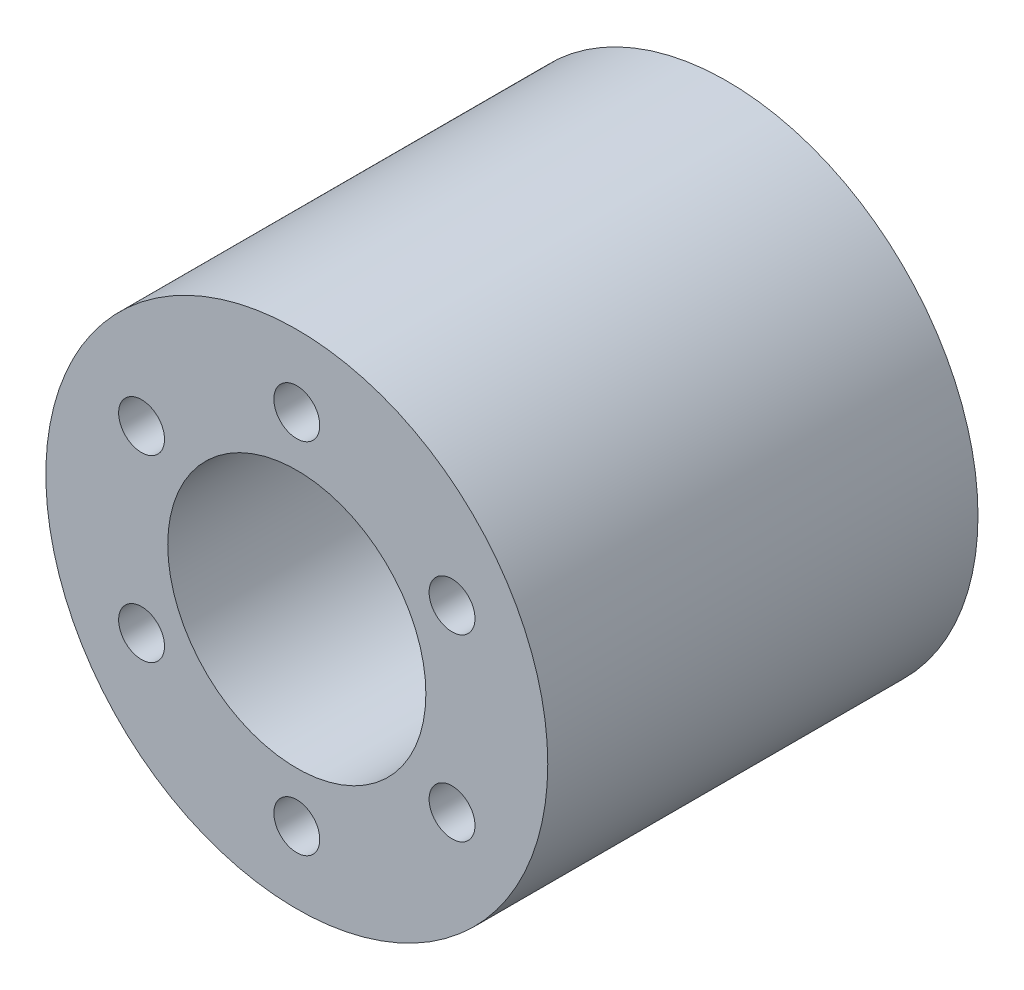
ISO-10303-21;
HEADER;
FILE_DESCRIPTION(('STEP AP214'),'2;1');
FILE_NAME('part.step','',(''),(''),'','','');
FILE_SCHEMA(('AUTOMOTIVE_DESIGN { 1 0 10303 214 1 1 1 1 }'));
ENDSEC;
DATA;
#1=APPLICATION_CONTEXT('core data for automotive mechanical design processes');
#2=APPLICATION_PROTOCOL_DEFINITION('international standard','automotive_design',2000,#1);
#3=PRODUCT_CONTEXT('',#1,'mechanical');
#4=PRODUCT('Part','Part','',(#3));
#5=PRODUCT_RELATED_PRODUCT_CATEGORY('part','',(#4));
#6=PRODUCT_DEFINITION_FORMATION('','',#4);
#7=PRODUCT_DEFINITION_CONTEXT('part definition',#1,'design');
#8=PRODUCT_DEFINITION('design','',#6,#7);
#9=PRODUCT_DEFINITION_SHAPE('','',#8);
#10=(LENGTH_UNIT() NAMED_UNIT(*) SI_UNIT(.MILLI.,.METRE.));
#11=(NAMED_UNIT(*) PLANE_ANGLE_UNIT() SI_UNIT($,.RADIAN.));
#12=(NAMED_UNIT(*) SI_UNIT($,.STERADIAN.) SOLID_ANGLE_UNIT());
#13=UNCERTAINTY_MEASURE_WITH_UNIT(LENGTH_MEASURE(1.E-05),#10,'distance_accuracy_value','');
#14=(GEOMETRIC_REPRESENTATION_CONTEXT(3) GLOBAL_UNCERTAINTY_ASSIGNED_CONTEXT((#13)) GLOBAL_UNIT_ASSIGNED_CONTEXT((#10,
#11,#12)) REPRESENTATION_CONTEXT('',''));
#15=CARTESIAN_POINT('',(0.,0.,0.));
#16=DIRECTION('',(0.,0.,1.));
#17=DIRECTION('',(1.,0.,0.));
#18=AXIS2_PLACEMENT_3D('',#15,#16,#17);
#19=CARTESIAN_POINT('',(0.,0.,30.));
#20=DIRECTION('',(0.,0.,1.));
#21=DIRECTION('',(1.,0.,0.));
#22=AXIS2_PLACEMENT_3D('',#19,#20,#21);
#23=PLANE('',#22);
#24=CARTESIAN_POINT('',(-10.8253175473055,6.24999999999999,30.));
#25=DIRECTION('',(0.,0.,1.));
#26=DIRECTION('',(1.,0.,0.));
#27=AXIS2_PLACEMENT_3D('',#24,#25,#26);
#28=CIRCLE('',#27,1.6);
#29=CARTESIAN_POINT('',(-9.22531754730549,6.24999999999999,30.));
#30=VERTEX_POINT('',#29);
#31=EDGE_CURVE('E71',#30,#30,#28,.T.);
#32=ORIENTED_EDGE('',*,*,#31,.F.);
#33=EDGE_LOOP('',(#32));
#34=FACE_BOUND('',#33,.T.);
#35=CARTESIAN_POINT('',(0.,-12.5,30.));
#36=DIRECTION('',(0.,0.,1.));
#37=DIRECTION('',(1.,0.,0.));
#38=AXIS2_PLACEMENT_3D('',#35,#36,#37);
#39=CIRCLE('',#38,1.6);
#40=CARTESIAN_POINT('',(1.6,-12.5,30.));
#41=VERTEX_POINT('',#40);
#42=EDGE_CURVE('E59',#41,#41,#39,.T.);
#43=ORIENTED_EDGE('',*,*,#42,.F.);
#44=EDGE_LOOP('',(#43));
#45=FACE_BOUND('',#44,.T.);
#46=CARTESIAN_POINT('',(10.8253175473055,6.25000000000001,30.));
#47=DIRECTION('',(0.,0.,1.));
#48=DIRECTION('',(1.,0.,0.));
#49=AXIS2_PLACEMENT_3D('',#46,#47,#48);
#50=CIRCLE('',#49,1.6);
#51=CARTESIAN_POINT('',(12.4253175473055,6.25000000000001,30.));
#52=VERTEX_POINT('',#51);
#53=EDGE_CURVE('E47',#52,#52,#50,.T.);
#54=ORIENTED_EDGE('',*,*,#53,.F.);
#55=EDGE_LOOP('',(#54));
#56=FACE_BOUND('',#55,.T.);
#57=CARTESIAN_POINT('',(0.,0.,30.));
#58=DIRECTION('',(0.,0.,1.));
#59=DIRECTION('',(1.,0.,0.));
#60=AXIS2_PLACEMENT_3D('',#57,#58,#59);
#61=CIRCLE('',#60,17.5);
#62=CARTESIAN_POINT('',(17.5,0.,30.));
#63=VERTEX_POINT('',#62);
#64=EDGE_CURVE('E10',#63,#63,#61,.T.);
#65=ORIENTED_EDGE('',*,*,#64,.T.);
#66=EDGE_LOOP('',(#65));
#67=FACE_BOUND('',#66,.T.);
#68=CARTESIAN_POINT('',(0.,12.5,30.));
#69=DIRECTION('',(0.,0.,1.));
#70=DIRECTION('',(1.,0.,0.));
#71=AXIS2_PLACEMENT_3D('',#68,#69,#70);
#72=CIRCLE('',#71,1.6);
#73=CARTESIAN_POINT('',(1.6,12.5,30.));
#74=VERTEX_POINT('',#73);
#75=EDGE_CURVE('E42',#74,#74,#72,.T.);
#76=ORIENTED_EDGE('',*,*,#75,.F.);
#77=EDGE_LOOP('',(#76));
#78=FACE_BOUND('',#77,.T.);
#79=CARTESIAN_POINT('',(10.8253175473055,-6.25,30.));
#80=DIRECTION('',(0.,0.,1.));
#81=DIRECTION('',(1.,0.,0.));
#82=AXIS2_PLACEMENT_3D('',#79,#80,#81);
#83=CIRCLE('',#82,1.6);
#84=CARTESIAN_POINT('',(12.4253175473055,-6.25,30.));
#85=VERTEX_POINT('',#84);
#86=EDGE_CURVE('E53',#85,#85,#83,.T.);
#87=ORIENTED_EDGE('',*,*,#86,.F.);
#88=EDGE_LOOP('',(#87));
#89=FACE_BOUND('',#88,.T.);
#90=CARTESIAN_POINT('',(-10.8253175473055,-6.25000000000001,30.));
#91=DIRECTION('',(0.,0.,1.));
#92=DIRECTION('',(1.,0.,0.));
#93=AXIS2_PLACEMENT_3D('',#90,#91,#92);
#94=CIRCLE('',#93,1.6);
#95=CARTESIAN_POINT('',(-9.22531754730549,-6.25000000000001,30.));
#96=VERTEX_POINT('',#95);
#97=EDGE_CURVE('E65',#96,#96,#94,.T.);
#98=ORIENTED_EDGE('',*,*,#97,.F.);
#99=EDGE_LOOP('',(#98));
#100=FACE_BOUND('',#99,.T.);
#101=CARTESIAN_POINT('',(0.,0.,30.));
#102=DIRECTION('',(0.,0.,1.));
#103=DIRECTION('',(1.,0.,0.));
#104=AXIS2_PLACEMENT_3D('',#101,#102,#103);
#105=CIRCLE('',#104,9.);
#106=CARTESIAN_POINT('',(9.,0.,30.));
#107=VERTEX_POINT('',#106);
#108=EDGE_CURVE('E77',#107,#107,#105,.T.);
#109=ORIENTED_EDGE('',*,*,#108,.F.);
#110=EDGE_LOOP('',(#109));
#111=FACE_BOUND('',#110,.T.);
#112=ADVANCED_FACE('F31',(#34,#45,#56,#67,#78,#89,#100,#111),#23,.T.);
#113=CARTESIAN_POINT('',(0.,0.,0.));
#114=DIRECTION('',(0.,0.,1.));
#115=DIRECTION('',(1.,0.,0.));
#116=AXIS2_PLACEMENT_3D('',#113,#114,#115);
#117=PLANE('',#116);
#118=CARTESIAN_POINT('',(0.,0.,0.));
#119=DIRECTION('',(0.,0.,1.));
#120=DIRECTION('',(1.,0.,0.));
#121=AXIS2_PLACEMENT_3D('',#118,#119,#120);
#122=CIRCLE('',#121,17.5);
#123=CARTESIAN_POINT('',(17.5,0.,0.));
#124=VERTEX_POINT('',#123);
#125=EDGE_CURVE('E35',#124,#124,#122,.T.);
#126=ORIENTED_EDGE('',*,*,#125,.F.);
#127=EDGE_LOOP('',(#126));
#128=FACE_BOUND('',#127,.T.);
#129=CARTESIAN_POINT('',(0.,12.5,0.));
#130=DIRECTION('',(0.,0.,1.));
#131=DIRECTION('',(1.,0.,0.));
#132=AXIS2_PLACEMENT_3D('',#129,#130,#131);
#133=CIRCLE('',#132,1.6);
#134=CARTESIAN_POINT('',(1.6,12.5,0.));
#135=VERTEX_POINT('',#134);
#136=EDGE_CURVE('E44',#135,#135,#133,.T.);
#137=ORIENTED_EDGE('',*,*,#136,.T.);
#138=EDGE_LOOP('',(#137));
#139=FACE_BOUND('',#138,.T.);
#140=CARTESIAN_POINT('',(10.8253175473055,6.25000000000001,0.));
#141=DIRECTION('',(0.,0.,1.));
#142=DIRECTION('',(1.,0.,0.));
#143=AXIS2_PLACEMENT_3D('',#140,#141,#142);
#144=CIRCLE('',#143,1.6);
#145=CARTESIAN_POINT('',(12.4253175473055,6.25000000000001,0.));
#146=VERTEX_POINT('',#145);
#147=EDGE_CURVE('E50',#146,#146,#144,.T.);
#148=ORIENTED_EDGE('',*,*,#147,.T.);
#149=EDGE_LOOP('',(#148));
#150=FACE_BOUND('',#149,.T.);
#151=CARTESIAN_POINT('',(10.8253175473055,-6.25,0.));
#152=DIRECTION('',(0.,0.,1.));
#153=DIRECTION('',(1.,0.,0.));
#154=AXIS2_PLACEMENT_3D('',#151,#152,#153);
#155=CIRCLE('',#154,1.6);
#156=CARTESIAN_POINT('',(12.4253175473055,-6.25,0.));
#157=VERTEX_POINT('',#156);
#158=EDGE_CURVE('E56',#157,#157,#155,.T.);
#159=ORIENTED_EDGE('',*,*,#158,.T.);
#160=EDGE_LOOP('',(#159));
#161=FACE_BOUND('',#160,.T.);
#162=CARTESIAN_POINT('',(0.,-12.5,0.));
#163=DIRECTION('',(0.,0.,1.));
#164=DIRECTION('',(1.,0.,0.));
#165=AXIS2_PLACEMENT_3D('',#162,#163,#164);
#166=CIRCLE('',#165,1.6);
#167=CARTESIAN_POINT('',(1.6,-12.5,0.));
#168=VERTEX_POINT('',#167);
#169=EDGE_CURVE('E62',#168,#168,#166,.T.);
#170=ORIENTED_EDGE('',*,*,#169,.T.);
#171=EDGE_LOOP('',(#170));
#172=FACE_BOUND('',#171,.T.);
#173=CARTESIAN_POINT('',(-10.8253175473055,-6.25000000000001,0.));
#174=DIRECTION('',(0.,0.,1.));
#175=DIRECTION('',(1.,0.,0.));
#176=AXIS2_PLACEMENT_3D('',#173,#174,#175);
#177=CIRCLE('',#176,1.6);
#178=CARTESIAN_POINT('',(-9.22531754730549,-6.25000000000001,0.));
#179=VERTEX_POINT('',#178);
#180=EDGE_CURVE('E68',#179,#179,#177,.T.);
#181=ORIENTED_EDGE('',*,*,#180,.T.);
#182=EDGE_LOOP('',(#181));
#183=FACE_BOUND('',#182,.T.);
#184=CARTESIAN_POINT('',(-10.8253175473055,6.24999999999999,0.));
#185=DIRECTION('',(0.,0.,1.));
#186=DIRECTION('',(1.,0.,0.));
#187=AXIS2_PLACEMENT_3D('',#184,#185,#186);
#188=CIRCLE('',#187,1.6);
#189=CARTESIAN_POINT('',(-9.22531754730549,6.24999999999999,0.));
#190=VERTEX_POINT('',#189);
#191=EDGE_CURVE('E74',#190,#190,#188,.T.);
#192=ORIENTED_EDGE('',*,*,#191,.T.);
#193=EDGE_LOOP('',(#192));
#194=FACE_BOUND('',#193,.T.);
#195=CARTESIAN_POINT('',(0.,0.,0.));
#196=DIRECTION('',(0.,0.,1.));
#197=DIRECTION('',(1.,0.,0.));
#198=AXIS2_PLACEMENT_3D('',#195,#196,#197);
#199=CIRCLE('',#198,9.);
#200=CARTESIAN_POINT('',(9.,0.,0.));
#201=VERTEX_POINT('',#200);
#202=EDGE_CURVE('E80',#201,#201,#199,.T.);
#203=ORIENTED_EDGE('',*,*,#202,.T.);
#204=EDGE_LOOP('',(#203));
#205=FACE_BOUND('',#204,.T.);
#206=ADVANCED_FACE('F90',(#128,#139,#150,#161,#172,#183,#194,#205),#117,.F.);
#207=CARTESIAN_POINT('',(0.,0.,30.));
#208=DIRECTION('',(0.,0.,-1.));
#209=DIRECTION('',(-1.,0.,0.));
#210=AXIS2_PLACEMENT_3D('',#207,#208,#209);
#211=CYLINDRICAL_SURFACE('',#210,17.5);
#212=ORIENTED_EDGE('',*,*,#64,.F.);
#213=EDGE_LOOP('',(#212));
#214=FACE_BOUND('',#213,.T.);
#215=ORIENTED_EDGE('',*,*,#125,.T.);
#216=EDGE_LOOP('',(#215));
#217=FACE_BOUND('',#216,.T.);
#218=ADVANCED_FACE('F33',(#214,#217),#211,.T.);
#219=CARTESIAN_POINT('',(0.,12.5,30.));
#220=DIRECTION('',(0.,0.,-1.));
#221=DIRECTION('',(-1.,0.,0.));
#222=AXIS2_PLACEMENT_3D('',#219,#220,#221);
#223=CYLINDRICAL_SURFACE('',#222,1.6);
#224=ORIENTED_EDGE('',*,*,#75,.T.);
#225=EDGE_LOOP('',(#224));
#226=FACE_BOUND('',#225,.T.);
#227=ORIENTED_EDGE('',*,*,#136,.F.);
#228=EDGE_LOOP('',(#227));
#229=FACE_BOUND('',#228,.T.);
#230=ADVANCED_FACE('F100',(#226,#229),#223,.F.);
#231=CARTESIAN_POINT('',(10.8253175473055,6.25000000000001,30.));
#232=DIRECTION('',(0.,0.,-1.));
#233=DIRECTION('',(-1.,0.,0.));
#234=AXIS2_PLACEMENT_3D('',#231,#232,#233);
#235=CYLINDRICAL_SURFACE('',#234,1.6);
#236=ORIENTED_EDGE('',*,*,#53,.T.);
#237=EDGE_LOOP('',(#236));
#238=FACE_BOUND('',#237,.T.);
#239=ORIENTED_EDGE('',*,*,#147,.F.);
#240=EDGE_LOOP('',(#239));
#241=FACE_BOUND('',#240,.T.);
#242=ADVANCED_FACE('F103',(#238,#241),#235,.F.);
#243=CARTESIAN_POINT('',(10.8253175473055,-6.25,30.));
#244=DIRECTION('',(0.,0.,-1.));
#245=DIRECTION('',(-1.,0.,0.));
#246=AXIS2_PLACEMENT_3D('',#243,#244,#245);
#247=CYLINDRICAL_SURFACE('',#246,1.6);
#248=ORIENTED_EDGE('',*,*,#86,.T.);
#249=EDGE_LOOP('',(#248));
#250=FACE_BOUND('',#249,.T.);
#251=ORIENTED_EDGE('',*,*,#158,.F.);
#252=EDGE_LOOP('',(#251));
#253=FACE_BOUND('',#252,.T.);
#254=ADVANCED_FACE('F107',(#250,#253),#247,.F.);
#255=CARTESIAN_POINT('',(0.,-12.5,30.));
#256=DIRECTION('',(0.,0.,-1.));
#257=DIRECTION('',(-1.,0.,0.));
#258=AXIS2_PLACEMENT_3D('',#255,#256,#257);
#259=CYLINDRICAL_SURFACE('',#258,1.6);
#260=ORIENTED_EDGE('',*,*,#42,.T.);
#261=EDGE_LOOP('',(#260));
#262=FACE_BOUND('',#261,.T.);
#263=ORIENTED_EDGE('',*,*,#169,.F.);
#264=EDGE_LOOP('',(#263));
#265=FACE_BOUND('',#264,.T.);
#266=ADVANCED_FACE('F111',(#262,#265),#259,.F.);
#267=CARTESIAN_POINT('',(-10.8253175473055,-6.25000000000001,30.));
#268=DIRECTION('',(0.,0.,-1.));
#269=DIRECTION('',(-1.,0.,0.));
#270=AXIS2_PLACEMENT_3D('',#267,#268,#269);
#271=CYLINDRICAL_SURFACE('',#270,1.6);
#272=ORIENTED_EDGE('',*,*,#97,.T.);
#273=EDGE_LOOP('',(#272));
#274=FACE_BOUND('',#273,.T.);
#275=ORIENTED_EDGE('',*,*,#180,.F.);
#276=EDGE_LOOP('',(#275));
#277=FACE_BOUND('',#276,.T.);
#278=ADVANCED_FACE('F115',(#274,#277),#271,.F.);
#279=CARTESIAN_POINT('',(-10.8253175473055,6.24999999999999,30.));
#280=DIRECTION('',(0.,0.,-1.));
#281=DIRECTION('',(-1.,0.,0.));
#282=AXIS2_PLACEMENT_3D('',#279,#280,#281);
#283=CYLINDRICAL_SURFACE('',#282,1.6);
#284=ORIENTED_EDGE('',*,*,#31,.T.);
#285=EDGE_LOOP('',(#284));
#286=FACE_BOUND('',#285,.T.);
#287=ORIENTED_EDGE('',*,*,#191,.F.);
#288=EDGE_LOOP('',(#287));
#289=FACE_BOUND('',#288,.T.);
#290=ADVANCED_FACE('F119',(#286,#289),#283,.F.);
#291=CARTESIAN_POINT('',(0.,0.,30.));
#292=DIRECTION('',(0.,0.,-1.));
#293=DIRECTION('',(-1.,0.,0.));
#294=AXIS2_PLACEMENT_3D('',#291,#292,#293);
#295=CYLINDRICAL_SURFACE('',#294,9.);
#296=ORIENTED_EDGE('',*,*,#108,.T.);
#297=EDGE_LOOP('',(#296));
#298=FACE_BOUND('',#297,.T.);
#299=ORIENTED_EDGE('',*,*,#202,.F.);
#300=EDGE_LOOP('',(#299));
#301=FACE_BOUND('',#300,.T.);
#302=ADVANCED_FACE('F86',(#298,#301),#295,.F.);
#303=CLOSED_SHELL('',(#112,#206,#218,#230,#242,#254,#266,#278,#290,#302));
#304=MANIFOLD_SOLID_BREP('B2',#303);
#305=ADVANCED_BREP_SHAPE_REPRESENTATION('',(#18,#304),#14);
#306=SHAPE_DEFINITION_REPRESENTATION(#9,#305);
ENDSEC;
END-ISO-10303-21;
